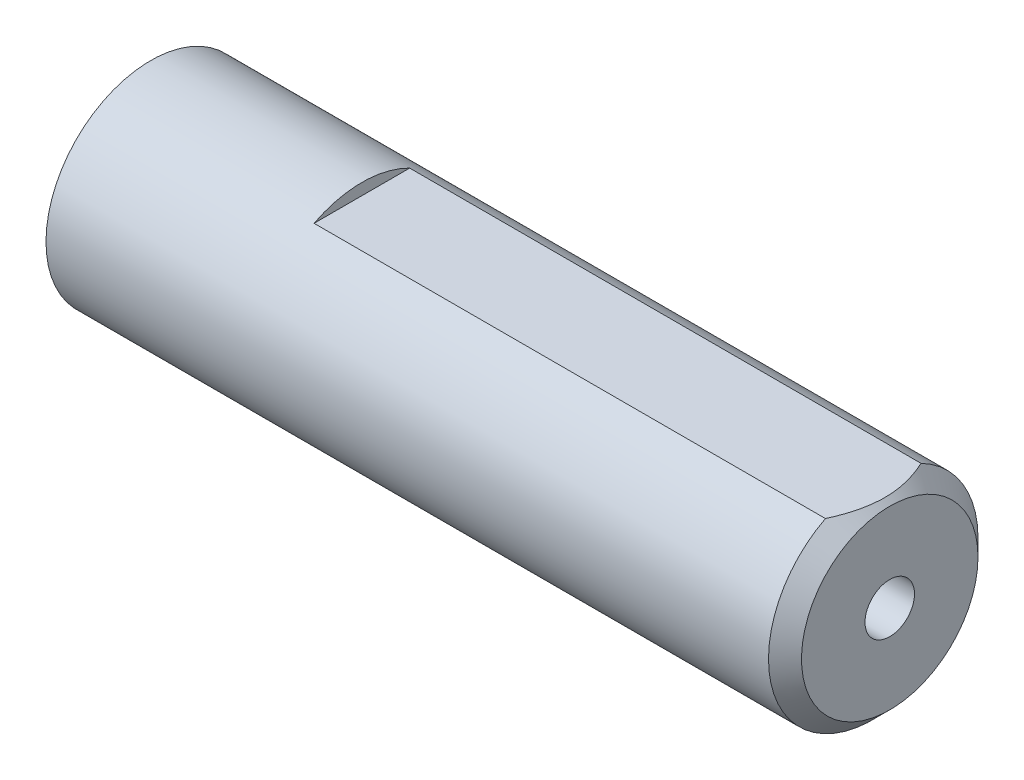
ISO-10303-21;
HEADER;
FILE_DESCRIPTION(('STEP AP214'),'2;1');
FILE_NAME('part.step','',(''),(''),'','','');
FILE_SCHEMA(('AUTOMOTIVE_DESIGN { 1 0 10303 214 1 1 1 1 }'));
ENDSEC;
DATA;
#1=APPLICATION_CONTEXT('core data for automotive mechanical design processes');
#2=APPLICATION_PROTOCOL_DEFINITION('international standard','automotive_design',2000,#1);
#3=PRODUCT_CONTEXT('',#1,'mechanical');
#4=PRODUCT('Part','Part','',(#3));
#5=PRODUCT_RELATED_PRODUCT_CATEGORY('part','',(#4));
#6=PRODUCT_DEFINITION_FORMATION('','',#4);
#7=PRODUCT_DEFINITION_CONTEXT('part definition',#1,'design');
#8=PRODUCT_DEFINITION('design','',#6,#7);
#9=PRODUCT_DEFINITION_SHAPE('','',#8);
#10=(LENGTH_UNIT() NAMED_UNIT(*) SI_UNIT(.MILLI.,.METRE.));
#11=(NAMED_UNIT(*) PLANE_ANGLE_UNIT() SI_UNIT($,.RADIAN.));
#12=(NAMED_UNIT(*) SI_UNIT($,.STERADIAN.) SOLID_ANGLE_UNIT());
#13=UNCERTAINTY_MEASURE_WITH_UNIT(LENGTH_MEASURE(1.E-05),#10,'distance_accuracy_value','');
#14=(GEOMETRIC_REPRESENTATION_CONTEXT(3) GLOBAL_UNCERTAINTY_ASSIGNED_CONTEXT((#13)) GLOBAL_UNIT_ASSIGNED_CONTEXT((#10,
#11,#12)) REPRESENTATION_CONTEXT('',''));
#15=CARTESIAN_POINT('',(0.,0.,0.));
#16=DIRECTION('',(0.,0.,1.));
#17=DIRECTION('',(1.,0.,0.));
#18=AXIS2_PLACEMENT_3D('',#15,#16,#17);
#19=CARTESIAN_POINT('',(22.4,0.,0.));
#20=DIRECTION('',(-1.,0.,0.));
#21=DIRECTION('',(0.,0.,1.));
#22=AXIS2_PLACEMENT_3D('',#19,#20,#21);
#23=CYLINDRICAL_SURFACE('',#22,3.175);
#24=CARTESIAN_POINT('',(21.9,0.,0.));
#25=DIRECTION('',(1.,0.,0.));
#26=DIRECTION('',(0.,0.,-1.));
#27=AXIS2_PLACEMENT_3D('',#24,#25,#26);
#28=CIRCLE('',#27,3.175);
#29=CARTESIAN_POINT('',(21.9,2.825,-1.44913767461894));
#30=VERTEX_POINT('',#29);
#31=CARTESIAN_POINT('',(21.9,2.825,1.44913767461894));
#32=VERTEX_POINT('',#31);
#33=EDGE_CURVE('E85',#30,#32,#28,.F.);
#34=ORIENTED_EDGE('',*,*,#33,.T.);
#35=DIRECTION('',(1.,0.,0.));
#36=VECTOR('',#35,1.);
#37=CARTESIAN_POINT('',(6.4,2.825,1.44913767461894));
#38=LINE('',#37,#36);
#39=CARTESIAN_POINT('',(6.4,2.825,1.44913767461894));
#40=VERTEX_POINT('',#39);
#41=EDGE_CURVE('E63',#40,#32,#38,.T.);
#42=ORIENTED_EDGE('',*,*,#41,.F.);
#43=CARTESIAN_POINT('',(6.4,0.,0.));
#44=DIRECTION('',(1.,0.,0.));
#45=DIRECTION('',(0.,0.,-1.));
#46=AXIS2_PLACEMENT_3D('',#43,#44,#45);
#47=CIRCLE('',#46,3.175);
#48=CARTESIAN_POINT('',(6.4,2.825,-1.44913767461894));
#49=VERTEX_POINT('',#48);
#50=EDGE_CURVE('E11',#49,#40,#47,.T.);
#51=ORIENTED_EDGE('',*,*,#50,.F.);
#52=DIRECTION('',(1.,0.,0.));
#53=VECTOR('',#52,1.);
#54=CARTESIAN_POINT('',(6.4,2.825,-1.44913767461894));
#55=LINE('',#54,#53);
#56=EDGE_CURVE('E78',#49,#30,#55,.T.);
#57=ORIENTED_EDGE('',*,*,#56,.T.);
#58=EDGE_LOOP('',(#34,#42,#51,#57));
#59=FACE_BOUND('',#58,.T.);
#60=CARTESIAN_POINT('',(0.,0.,0.));
#61=DIRECTION('',(1.,0.,0.));
#62=DIRECTION('',(0.,0.,-1.));
#63=AXIS2_PLACEMENT_3D('',#60,#61,#62);
#64=CIRCLE('',#63,3.175);
#65=CARTESIAN_POINT('',(0.,0.,-3.175));
#66=VERTEX_POINT('',#65);
#67=EDGE_CURVE('E89',#66,#66,#64,.T.);
#68=ORIENTED_EDGE('',*,*,#67,.T.);
#69=EDGE_LOOP('',(#68));
#70=FACE_BOUND('',#69,.T.);
#71=ADVANCED_FACE('F45',(#59,#70),#23,.T.);
#72=CARTESIAN_POINT('',(22.4,0.,0.));
#73=DIRECTION('',(1.,0.,0.));
#74=DIRECTION('',(0.,0.,-1.));
#75=AXIS2_PLACEMENT_3D('',#72,#73,#74);
#76=PLANE('',#75);
#77=CARTESIAN_POINT('',(22.4,0.,0.));
#78=DIRECTION('',(1.,0.,0.));
#79=DIRECTION('',(0.,0.,-1.));
#80=AXIS2_PLACEMENT_3D('',#77,#78,#79);
#81=CIRCLE('',#80,0.75);
#82=CARTESIAN_POINT('',(22.4,0.,-0.75));
#83=VERTEX_POINT('',#82);
#84=EDGE_CURVE('E196',#83,#83,#81,.T.);
#85=ORIENTED_EDGE('',*,*,#84,.F.);
#86=EDGE_LOOP('',(#85));
#87=FACE_BOUND('',#86,.T.);
#88=CARTESIAN_POINT('',(22.4,0.,0.));
#89=DIRECTION('',(1.,0.,0.));
#90=DIRECTION('',(0.,0.,-1.));
#91=AXIS2_PLACEMENT_3D('',#88,#89,#90);
#92=CIRCLE('',#91,2.675);
#93=CARTESIAN_POINT('',(22.4,0.,-2.675));
#94=VERTEX_POINT('',#93);
#95=EDGE_CURVE('E95',#94,#94,#92,.T.);
#96=ORIENTED_EDGE('',*,*,#95,.T.);
#97=EDGE_LOOP('',(#96));
#98=FACE_BOUND('',#97,.T.);
#99=ADVANCED_FACE('F112',(#87,#98),#76,.T.);
#100=CARTESIAN_POINT('',(0.,0.,0.));
#101=DIRECTION('',(1.,0.,0.));
#102=DIRECTION('',(0.,0.,-1.));
#103=AXIS2_PLACEMENT_3D('',#100,#101,#102);
#104=PLANE('',#103);
#105=ORIENTED_EDGE('',*,*,#67,.F.);
#106=EDGE_LOOP('',(#105));
#107=FACE_BOUND('',#106,.T.);
#108=ADVANCED_FACE('F115',(#107),#104,.F.);
#109=CARTESIAN_POINT('',(22.4,0.,0.));
#110=DIRECTION('',(-1.,0.,0.));
#111=DIRECTION('',(0.,0.,1.));
#112=AXIS2_PLACEMENT_3D('',#109,#110,#111);
#113=CONICAL_SURFACE('',#112,2.675,0.785398163397447);
#114=CARTESIAN_POINT('',(19.8542275802508,2.825,4.39042590858949));
#115=CARTESIAN_POINT('',(19.9698041562098,2.825,4.25292074022105));
#116=CARTESIAN_POINT('',(20.0845246171203,2.825,4.1146762905363));
#117=CARTESIAN_POINT('',(20.3116180330734,2.825,3.83612451267616));
#118=CARTESIAN_POINT('',(20.4239893964688,2.825,3.6958158890006));
#119=CARTESIAN_POINT('',(20.6503254661864,2.825,3.40668879887257));
#120=CARTESIAN_POINT('',(20.764153427416,2.825,3.25776274001047));
#121=CARTESIAN_POINT('',(20.9870919019644,2.825,2.95646126766161));
#122=CARTESIAN_POINT('',(21.096203761441,2.825,2.80408685764218));
#123=CARTESIAN_POINT('',(21.3081611425993,2.825,2.49424904134586));
#124=CARTESIAN_POINT('',(21.4109841951502,2.825,2.33677015050048));
#125=CARTESIAN_POINT('',(21.6070186015877,2.825,2.01557223611452));
#126=CARTESIAN_POINT('',(21.7002197761769,2.825,1.85184684990033));
#127=CARTESIAN_POINT('',(21.8281331190279,2.825,1.60201820684214));
#128=CARTESIAN_POINT('',(21.86847357645,2.825,1.51881353954679));
#129=CARTESIAN_POINT('',(21.9447332610715,2.825,1.35041067469539));
#130=CARTESIAN_POINT('',(21.9806519274967,2.825,1.26521222591398));
#131=CARTESIAN_POINT('',(22.0801426210639,2.825,1.00681056594433));
#132=CARTESIAN_POINT('',(22.1357327275523,2.825,0.830273355762961));
#133=CARTESIAN_POINT('',(22.196381071094,2.825,0.560001496609091));
#134=CARTESIAN_POINT('',(22.2128194606892,2.825,0.46877737941434));
#135=CARTESIAN_POINT('',(22.2370990274736,2.825,0.285165088840998));
#136=CARTESIAN_POINT('',(22.2449409860072,2.825,0.192777022028001));
#137=CARTESIAN_POINT('',(22.2514992563376,2.825,0.00781697228856498));
#138=CARTESIAN_POINT('',(22.2502295445123,2.825,-0.0847545113078183));
#139=CARTESIAN_POINT('',(22.2386858962154,2.825,-0.269333596516036));
#140=CARTESIAN_POINT('',(22.2284110830507,2.825,-0.361341142347367));
#141=CARTESIAN_POINT('',(22.1997002761794,2.825,-0.542821870257181));
#142=CARTESIAN_POINT('',(22.1813722256506,2.825,-0.632312451651969));
#143=CARTESIAN_POINT('',(22.1375608441347,2.825,-0.809506381092833));
#144=CARTESIAN_POINT('',(22.1120768842855,2.825,-0.897209571335901));
#145=CARTESIAN_POINT('',(22.0547257680386,2.825,-1.07158485976423));
#146=CARTESIAN_POINT('',(22.022789367431,2.825,-1.15823391637024));
#147=CARTESIAN_POINT('',(21.953803103388,2.825,-1.32942774583637));
#148=CARTESIAN_POINT('',(21.9167542682537,2.825,-1.41397293783579));
#149=CARTESIAN_POINT('',(21.8129376877493,2.825,-1.63565139418216));
#150=CARTESIAN_POINT('',(21.7425569191534,2.825,-1.77108787913489));
#151=CARTESIAN_POINT('',(21.5936699282048,2.825,-2.03745575046364));
#152=CARTESIAN_POINT('',(21.515157741708,2.825,-2.16838373485654));
#153=CARTESIAN_POINT('',(21.3519720183297,2.825,-2.42701603100131));
#154=CARTESIAN_POINT('',(21.2672760253149,2.825,-2.55470606803013));
#155=CARTESIAN_POINT('',(21.093573182432,2.825,-2.80704458551669));
#156=CARTESIAN_POINT('',(21.0045675496574,2.825,-2.9316939099255));
#157=CARTESIAN_POINT('',(20.8294655552461,2.825,-3.17017788199633));
#158=CARTESIAN_POINT('',(20.7435838843871,2.825,-3.28417090828486));
#159=CARTESIAN_POINT('',(20.5695927319126,2.825,-3.51045546231666));
#160=CARTESIAN_POINT('',(20.481483052715,2.825,-3.62274683773361));
#161=CARTESIAN_POINT('',(20.3042927562352,2.825,-3.844929833631));
#162=CARTESIAN_POINT('',(20.2152277128591,2.825,-3.95483390992788));
#163=CARTESIAN_POINT('',(20.03570097677,2.825,-4.17345698331682));
#164=CARTESIAN_POINT('',(19.9452395877408,2.825,-4.28217622955525));
#165=CARTESIAN_POINT('',(19.8542275802508,2.825,-4.39042590858949));
#166=B_SPLINE_CURVE_WITH_KNOTS('',3,(#114,#115,#116,#117,#118,#119,#120,#121,#122,#123,#124,
#125,#126,#127,#128,#129,#130,#131,#132,#133,#134,#135,#136,#137,#138,#139,#140,#141,#142,#143,
#144,#145,#146,#147,#148,#149,#150,#151,#152,#153,#154,#155,#156,#157,#158,#159,#160,#161,#162,
#163,#164,#165),.UNSPECIFIED.,.F.,.F.,(4,2,2,2,2,2,2,2,2,2,2,2,2,2,2,2,2,2,2,2,2,2,2,2,2,4),(0.,
0.538898038945093,1.07815009439359,1.64042115343604,2.20253064413539,2.76654346516319,
3.33114698744618,3.60842999308,3.88574812776529,4.43859637550752,4.71633866874901,
4.99405571542315,5.27134686347551,5.54866501024786,5.82237435618032,6.09610776325255,
6.37295171525909,6.64974006457499,7.10720398024612,7.56500584027602,8.02456189237511,
8.48398890884466,8.91212701428765,9.34030322153689,9.76467652504445,10.188958799138),.UNSPECIFIED.);
#167=EDGE_CURVE('E56',#32,#30,#166,.T.);
#168=ORIENTED_EDGE('',*,*,#167,.F.);
#169=ORIENTED_EDGE('',*,*,#33,.F.);
#170=EDGE_LOOP('',(#168,#169));
#171=FACE_BOUND('',#170,.T.);
#172=ORIENTED_EDGE('',*,*,#95,.F.);
#173=EDGE_LOOP('',(#172));
#174=FACE_BOUND('',#173,.T.);
#175=ADVANCED_FACE('F48',(#171,#174),#113,.T.);
#176=CARTESIAN_POINT('',(6.4,0.,0.));
#177=DIRECTION('',(1.,0.,0.));
#178=DIRECTION('',(0.,0.,-1.));
#179=AXIS2_PLACEMENT_3D('',#176,#177,#178);
#180=PLANE('',#179);
#181=DIRECTION('',(0.,0.,-1.));
#182=VECTOR('',#181,1.);
#183=CARTESIAN_POINT('',(6.4,2.825,1.44913767461894));
#184=LINE('',#183,#182);
#185=EDGE_CURVE('E75',#40,#49,#184,.T.);
#186=ORIENTED_EDGE('',*,*,#185,.T.);
#187=ORIENTED_EDGE('',*,*,#50,.T.);
#188=EDGE_LOOP('',(#186,#187));
#189=FACE_BOUND('',#188,.T.);
#190=ADVANCED_FACE('F74',(#189),#180,.T.);
#191=CARTESIAN_POINT('',(6.4,2.825,1.44913767461894));
#192=DIRECTION('',(0.,-1.,0.));
#193=DIRECTION('',(0.,0.,-1.));
#194=AXIS2_PLACEMENT_3D('',#191,#192,#193);
#195=PLANE('',#194);
#196=ORIENTED_EDGE('',*,*,#167,.T.);
#197=ORIENTED_EDGE('',*,*,#56,.F.);
#198=ORIENTED_EDGE('',*,*,#185,.F.);
#199=ORIENTED_EDGE('',*,*,#41,.T.);
#200=EDGE_LOOP('',(#196,#197,#198,#199));
#201=FACE_BOUND('',#200,.T.);
#202=ADVANCED_FACE('F77',(#201),#195,.F.);
#203=CARTESIAN_POINT('',(19.4,0.,0.));
#204=DIRECTION('',(1.,0.,0.));
#205=DIRECTION('',(0.,0.,-1.));
#206=AXIS2_PLACEMENT_3D('',#203,#204,#205);
#207=CYLINDRICAL_SURFACE('',#206,0.75);
#208=CARTESIAN_POINT('',(19.4,0.,0.));
#209=DIRECTION('',(1.,0.,0.));
#210=DIRECTION('',(0.,0.,-1.));
#211=AXIS2_PLACEMENT_3D('',#208,#209,#210);
#212=CIRCLE('',#211,0.75);
#213=CARTESIAN_POINT('',(19.4,0.,-0.75));
#214=VERTEX_POINT('',#213);
#215=EDGE_CURVE('E80',#214,#214,#212,.T.);
#216=ORIENTED_EDGE('',*,*,#215,.F.);
#217=EDGE_LOOP('',(#216));
#218=FACE_BOUND('',#217,.T.);
#219=ORIENTED_EDGE('',*,*,#84,.T.);
#220=EDGE_LOOP('',(#219));
#221=FACE_BOUND('',#220,.T.);
#222=ADVANCED_FACE('F110',(#218,#221),#207,.F.);
#223=CARTESIAN_POINT('',(19.4,0.,0.));
#224=DIRECTION('',(1.,0.,0.));
#225=DIRECTION('',(0.,0.,-1.));
#226=AXIS2_PLACEMENT_3D('',#223,#224,#225);
#227=PLANE('',#226);
#228=ORIENTED_EDGE('',*,*,#215,.T.);
#229=EDGE_LOOP('',(#228));
#230=FACE_BOUND('',#229,.T.);
#231=ADVANCED_FACE('F151',(#230),#227,.T.);
#232=CLOSED_SHELL('',(#71,#99,#108,#175,#190,#202,#222,#231));
#233=MANIFOLD_SOLID_BREP('B2',#232);
#234=ADVANCED_BREP_SHAPE_REPRESENTATION('',(#18,#233),#14);
#235=SHAPE_DEFINITION_REPRESENTATION(#9,#234);
ENDSEC;
END-ISO-10303-21;
